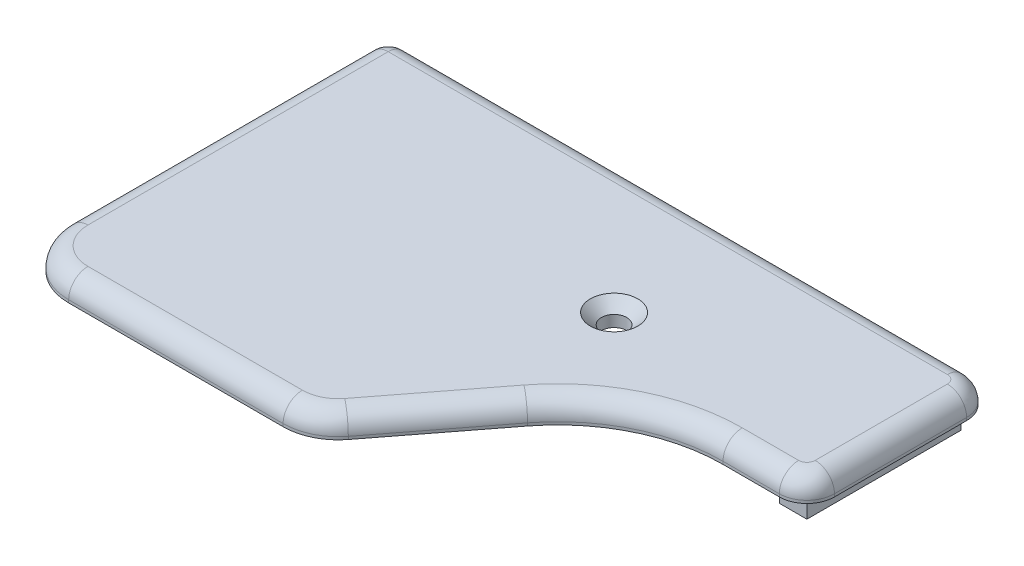
ISO-10303-21;
HEADER;
FILE_DESCRIPTION(('STEP AP214'),'2;1');
FILE_NAME('part.step','',(''),(''),'','','');
FILE_SCHEMA(('AUTOMOTIVE_DESIGN { 1 0 10303 214 1 1 1 1 }'));
ENDSEC;
DATA;
#1=APPLICATION_CONTEXT('core data for automotive mechanical design processes');
#2=APPLICATION_PROTOCOL_DEFINITION('international standard','automotive_design',2000,#1);
#3=PRODUCT_CONTEXT('',#1,'mechanical');
#4=PRODUCT('Part','Part','',(#3));
#5=PRODUCT_RELATED_PRODUCT_CATEGORY('part','',(#4));
#6=PRODUCT_DEFINITION_FORMATION('','',#4);
#7=PRODUCT_DEFINITION_CONTEXT('part definition',#1,'design');
#8=PRODUCT_DEFINITION('design','',#6,#7);
#9=PRODUCT_DEFINITION_SHAPE('','',#8);
#10=(LENGTH_UNIT() NAMED_UNIT(*) SI_UNIT(.MILLI.,.METRE.));
#11=(NAMED_UNIT(*) PLANE_ANGLE_UNIT() SI_UNIT($,.RADIAN.));
#12=(NAMED_UNIT(*) SI_UNIT($,.STERADIAN.) SOLID_ANGLE_UNIT());
#13=UNCERTAINTY_MEASURE_WITH_UNIT(LENGTH_MEASURE(1.E-05),#10,'distance_accuracy_value','');
#14=(GEOMETRIC_REPRESENTATION_CONTEXT(3) GLOBAL_UNCERTAINTY_ASSIGNED_CONTEXT((#13)) GLOBAL_UNIT_ASSIGNED_CONTEXT((#10,
#11,#12)) REPRESENTATION_CONTEXT('',''));
#15=CARTESIAN_POINT('',(0.,0.,0.));
#16=DIRECTION('',(0.,0.,1.));
#17=DIRECTION('',(1.,0.,0.));
#18=AXIS2_PLACEMENT_3D('',#15,#16,#17);
#19=CARTESIAN_POINT('',(0.,0.,0.));
#20=DIRECTION('',(0.,-1.,0.));
#21=DIRECTION('',(0.,0.,-1.));
#22=AXIS2_PLACEMENT_3D('',#19,#20,#21);
#23=PLANE('',#22);
#24=DIRECTION('',(0.,0.,1.));
#25=VECTOR('',#24,1.);
#26=CARTESIAN_POINT('',(0.,0.,38.1));
#27=LINE('',#26,#25);
#28=CARTESIAN_POINT('',(0.,0.,2.2225));
#29=VERTEX_POINT('',#28);
#30=CARTESIAN_POINT('',(0.,0.,36.83));
#31=VERTEX_POINT('',#30);
#32=EDGE_CURVE('E213',#29,#31,#27,.T.);
#33=ORIENTED_EDGE('',*,*,#32,.F.);
#34=CARTESIAN_POINT('',(2.2225,0.,2.2225));
#35=DIRECTION('',(0.,-1.,0.));
#36=DIRECTION('',(0.,0.,-1.));
#37=AXIS2_PLACEMENT_3D('',#34,#35,#36);
#38=CIRCLE('',#37,2.2225);
#39=CARTESIAN_POINT('',(2.2225,0.,0.));
#40=VERTEX_POINT('',#39);
#41=EDGE_CURVE('E271',#29,#40,#38,.T.);
#42=ORIENTED_EDGE('',*,*,#41,.T.);
#43=DIRECTION('',(-1.,0.,0.));
#44=VECTOR('',#43,1.);
#45=CARTESIAN_POINT('',(0.,0.,0.));
#46=LINE('',#45,#44);
#47=CARTESIAN_POINT('',(66.675,0.,0.));
#48=VERTEX_POINT('',#47);
#49=EDGE_CURVE('E231',#48,#40,#46,.T.);
#50=ORIENTED_EDGE('',*,*,#49,.F.);
#51=CARTESIAN_POINT('',(66.675,0.,3.175));
#52=DIRECTION('',(0.,-1.,0.));
#53=DIRECTION('',(0.,0.,-1.));
#54=AXIS2_PLACEMENT_3D('',#51,#52,#53);
#55=CIRCLE('',#54,3.175);
#56=CARTESIAN_POINT('',(69.85,0.,3.175));
#57=VERTEX_POINT('',#56);
#58=EDGE_CURVE('E259',#48,#57,#55,.T.);
#59=ORIENTED_EDGE('',*,*,#58,.T.);
#60=DIRECTION('',(0.,0.,-1.));
#61=VECTOR('',#60,1.);
#62=CARTESIAN_POINT('',(69.85,0.,0.));
#63=LINE('',#62,#61);
#64=CARTESIAN_POINT('',(69.85,0.,18.415));
#65=VERTEX_POINT('',#64);
#66=EDGE_CURVE('E228',#65,#57,#63,.T.);
#67=ORIENTED_EDGE('',*,*,#66,.F.);
#68=CARTESIAN_POINT('',(66.675,0.,18.415));
#69=DIRECTION('',(0.,-1.,0.));
#70=DIRECTION('',(0.,0.,-1.));
#71=AXIS2_PLACEMENT_3D('',#68,#69,#70);
#72=CIRCLE('',#71,3.175);
#73=CARTESIAN_POINT('',(66.675,0.,21.59));
#74=VERTEX_POINT('',#73);
#75=EDGE_CURVE('E257',#65,#74,#72,.T.);
#76=ORIENTED_EDGE('',*,*,#75,.T.);
#77=DIRECTION('',(1.,0.,0.));
#78=VECTOR('',#77,1.);
#79=CARTESIAN_POINT('',(69.85,0.,21.59));
#80=LINE('',#79,#78);
#81=CARTESIAN_POINT('',(60.1802485264324,0.,21.59));
#82=VERTEX_POINT('',#81);
#83=EDGE_CURVE('E225',#82,#74,#80,.T.);
#84=ORIENTED_EDGE('',*,*,#83,.F.);
#85=CARTESIAN_POINT('',(60.1802485264324,0.,40.64));
#86=DIRECTION('',(0.,-1.,0.));
#87=DIRECTION('',(0.,0.,-1.));
#88=AXIS2_PLACEMENT_3D('',#85,#86,#87);
#89=CIRCLE('',#88,19.05);
#90=CARTESIAN_POINT('',(45.0807615339897,0.,29.0250100058134));
#91=VERTEX_POINT('',#90);
#92=EDGE_CURVE('E239',#82,#91,#89,.F.);
#93=ORIENTED_EDGE('',*,*,#92,.T.);
#94=DIRECTION('',(0.609710760849692,0.,-0.7926239891046));
#95=VECTOR('',#94,1.);
#96=CARTESIAN_POINT('',(50.8,0.,21.59));
#97=LINE('',#96,#95);
#98=CARTESIAN_POINT('',(36.0987205143111,0.,40.7016633313956));
#99=VERTEX_POINT('',#98);
#100=EDGE_CURVE('E223',#99,#91,#97,.T.);
#101=ORIENTED_EDGE('',*,*,#100,.F.);
#102=CARTESIAN_POINT('',(31.0655581834969,0.,36.83));
#103=DIRECTION('',(0.,-1.,0.));
#104=DIRECTION('',(0.,0.,-1.));
#105=AXIS2_PLACEMENT_3D('',#102,#103,#104);
#106=CIRCLE('',#105,6.35);
#107=CARTESIAN_POINT('',(31.0655581834969,0.,43.18));
#108=VERTEX_POINT('',#107);
#109=EDGE_CURVE('E246',#99,#108,#106,.T.);
#110=ORIENTED_EDGE('',*,*,#109,.T.);
#111=DIRECTION('',(1.,0.,0.));
#112=VECTOR('',#111,1.);
#113=CARTESIAN_POINT('',(0.,0.,43.18));
#114=LINE('',#113,#112);
#115=CARTESIAN_POINT('',(6.35,0.,43.18));
#116=VERTEX_POINT('',#115);
#117=EDGE_CURVE('E220',#116,#108,#114,.T.);
#118=ORIENTED_EDGE('',*,*,#117,.F.);
#119=CARTESIAN_POINT('',(6.35,0.,36.83));
#120=DIRECTION('',(0.,-1.,0.));
#121=DIRECTION('',(0.,0.,-1.));
#122=AXIS2_PLACEMENT_3D('',#119,#120,#121);
#123=CIRCLE('',#122,6.35);
#124=EDGE_CURVE('E248',#116,#31,#123,.T.);
#125=ORIENTED_EDGE('',*,*,#124,.T.);
#126=EDGE_LOOP('',(#33,#42,#50,#59,#67,#76,#84,#93,#101,#110,#118,#125));
#127=FACE_BOUND('',#126,.T.);
#128=CARTESIAN_POINT('',(41.275,0.,15.24));
#129=DIRECTION('',(0.,1.,0.));
#130=DIRECTION('',(0.,0.,1.));
#131=AXIS2_PLACEMENT_3D('',#128,#129,#130);
#132=CIRCLE('',#131,1.46050000000001);
#133=CARTESIAN_POINT('',(41.275,0.,16.7005));
#134=VERTEX_POINT('',#133);
#135=EDGE_CURVE('E210',#134,#134,#132,.T.);
#136=ORIENTED_EDGE('',*,*,#135,.T.);
#137=EDGE_LOOP('',(#136));
#138=FACE_BOUND('',#137,.T.);
#139=DIRECTION('',(1.,0.,0.));
#140=VECTOR('',#139,1.);
#141=CARTESIAN_POINT('',(64.77,0.,1.905));
#142=LINE('',#141,#140);
#143=CARTESIAN_POINT('',(64.77,0.,1.905));
#144=VERTEX_POINT('',#143);
#145=CARTESIAN_POINT('',(67.945,0.,1.905));
#146=VERTEX_POINT('',#145);
#147=EDGE_CURVE('E364',#144,#146,#142,.T.);
#148=ORIENTED_EDGE('',*,*,#147,.F.);
#149=DIRECTION('',(0.,0.,-1.));
#150=VECTOR('',#149,1.);
#151=CARTESIAN_POINT('',(64.77,0.,19.685));
#152=LINE('',#151,#150);
#153=CARTESIAN_POINT('',(64.77,0.,19.685));
#154=VERTEX_POINT('',#153);
#155=EDGE_CURVE('E208',#154,#144,#152,.T.);
#156=ORIENTED_EDGE('',*,*,#155,.F.);
#157=DIRECTION('',(-1.,0.,0.));
#158=VECTOR('',#157,1.);
#159=CARTESIAN_POINT('',(64.77,0.,19.685));
#160=LINE('',#159,#158);
#161=CARTESIAN_POINT('',(67.945,0.,19.685));
#162=VERTEX_POINT('',#161);
#163=EDGE_CURVE('E204',#162,#154,#160,.T.);
#164=ORIENTED_EDGE('',*,*,#163,.F.);
#165=DIRECTION('',(0.,0.,1.));
#166=VECTOR('',#165,1.);
#167=CARTESIAN_POINT('',(67.945,0.,19.685));
#168=LINE('',#167,#166);
#169=EDGE_CURVE('E366',#146,#162,#168,.T.);
#170=ORIENTED_EDGE('',*,*,#169,.F.);
#171=EDGE_LOOP('',(#148,#156,#164,#170));
#172=FACE_BOUND('',#171,.T.);
#173=ADVANCED_FACE('F37',(#127,#138,#172),#23,.T.);
#174=CARTESIAN_POINT('',(0.,2.54,0.));
#175=DIRECTION('',(0.,-1.,0.));
#176=DIRECTION('',(0.,0.,-1.));
#177=AXIS2_PLACEMENT_3D('',#174,#175,#176);
#178=PLANE('',#177);
#179=CARTESIAN_POINT('',(66.675,2.54,3.175));
#180=DIRECTION('',(0.,-1.,0.));
#181=DIRECTION('',(0.,0.,-1.));
#182=AXIS2_PLACEMENT_3D('',#179,#180,#181);
#183=CIRCLE('',#182,0.9525);
#184=CARTESIAN_POINT('',(67.6275,2.54,3.175));
#185=VERTEX_POINT('',#184);
#186=CARTESIAN_POINT('',(66.675,2.54,2.2225));
#187=VERTEX_POINT('',#186);
#188=EDGE_CURVE('E303',#185,#187,#183,.F.);
#189=ORIENTED_EDGE('',*,*,#188,.T.);
#190=DIRECTION('',(-1.,0.,0.));
#191=VECTOR('',#190,1.);
#192=CARTESIAN_POINT('',(0.,2.54,2.2225));
#193=LINE('',#192,#191);
#194=CARTESIAN_POINT('',(2.22249999999999,2.54,2.2225));
#195=VERTEX_POINT('',#194);
#196=EDGE_CURVE('E305',#187,#195,#193,.T.);
#197=ORIENTED_EDGE('',*,*,#196,.T.);
#198=DIRECTION('',(0.,0.,1.));
#199=VECTOR('',#198,1.);
#200=CARTESIAN_POINT('',(2.22249999999999,2.54,0.));
#201=LINE('',#200,#199);
#202=CARTESIAN_POINT('',(2.2225,2.54,36.83));
#203=VERTEX_POINT('',#202);
#204=EDGE_CURVE('E285',#195,#203,#201,.T.);
#205=ORIENTED_EDGE('',*,*,#204,.T.);
#206=CARTESIAN_POINT('',(6.35,2.54,36.83));
#207=DIRECTION('',(0.,-1.,0.));
#208=DIRECTION('',(0.,0.,-1.));
#209=AXIS2_PLACEMENT_3D('',#206,#207,#208);
#210=CIRCLE('',#209,4.1275);
#211=CARTESIAN_POINT('',(6.35,2.54,40.9575));
#212=VERTEX_POINT('',#211);
#213=EDGE_CURVE('E287',#203,#212,#210,.F.);
#214=ORIENTED_EDGE('',*,*,#213,.T.);
#215=DIRECTION('',(1.,0.,0.));
#216=VECTOR('',#215,1.);
#217=CARTESIAN_POINT('',(0.,2.54,40.9575));
#218=LINE('',#217,#216);
#219=CARTESIAN_POINT('',(31.0655581834969,2.54,40.9575));
#220=VERTEX_POINT('',#219);
#221=EDGE_CURVE('E289',#212,#220,#218,.T.);
#222=ORIENTED_EDGE('',*,*,#221,.T.);
#223=CARTESIAN_POINT('',(31.0655581834969,2.54,36.83));
#224=DIRECTION('',(0.,-1.,0.));
#225=DIRECTION('',(0.,0.,-1.));
#226=AXIS2_PLACEMENT_3D('',#223,#224,#225);
#227=CIRCLE('',#226,4.1275);
#228=CARTESIAN_POINT('',(34.3371136985261,2.54,39.3465811654071));
#229=VERTEX_POINT('',#228);
#230=EDGE_CURVE('E291',#220,#229,#227,.F.);
#231=ORIENTED_EDGE('',*,*,#230,.T.);
#232=DIRECTION('',(0.609710760849692,0.,-0.7926239891046));
#233=VECTOR('',#232,1.);
#234=CARTESIAN_POINT('',(40.5874638161853,2.54,31.2211260124502));
#235=LINE('',#234,#233);
#236=CARTESIAN_POINT('',(43.3191547182048,2.54,27.6699278398249));
#237=VERTEX_POINT('',#236);
#238=EDGE_CURVE('E293',#229,#237,#235,.T.);
#239=ORIENTED_EDGE('',*,*,#238,.T.);
#240=CARTESIAN_POINT('',(60.1802485264324,2.54,40.64));
#241=DIRECTION('',(0.,-1.,0.));
#242=DIRECTION('',(0.,0.,-1.));
#243=AXIS2_PLACEMENT_3D('',#240,#241,#242);
#244=CIRCLE('',#243,21.2725);
#245=CARTESIAN_POINT('',(60.1802485264324,2.54,19.3675));
#246=VERTEX_POINT('',#245);
#247=EDGE_CURVE('E295',#237,#246,#244,.T.);
#248=ORIENTED_EDGE('',*,*,#247,.T.);
#249=DIRECTION('',(1.,0.,0.));
#250=VECTOR('',#249,1.);
#251=CARTESIAN_POINT('',(0.,2.54,19.3675));
#252=LINE('',#251,#250);
#253=CARTESIAN_POINT('',(66.675,2.54,19.3675));
#254=VERTEX_POINT('',#253);
#255=EDGE_CURVE('E297',#246,#254,#252,.T.);
#256=ORIENTED_EDGE('',*,*,#255,.T.);
#257=CARTESIAN_POINT('',(66.675,2.54,18.415));
#258=DIRECTION('',(0.,-1.,0.));
#259=DIRECTION('',(0.,0.,-1.));
#260=AXIS2_PLACEMENT_3D('',#257,#258,#259);
#261=CIRCLE('',#260,0.9525);
#262=CARTESIAN_POINT('',(67.6275,2.54,18.415));
#263=VERTEX_POINT('',#262);
#264=EDGE_CURVE('E299',#254,#263,#261,.F.);
#265=ORIENTED_EDGE('',*,*,#264,.T.);
#266=DIRECTION('',(0.,0.,-1.));
#267=VECTOR('',#266,1.);
#268=CARTESIAN_POINT('',(67.6275,2.54,0.));
#269=LINE('',#268,#267);
#270=EDGE_CURVE('E301',#263,#185,#269,.T.);
#271=ORIENTED_EDGE('',*,*,#270,.T.);
#272=EDGE_LOOP('',(#189,#197,#205,#214,#222,#231,#239,#248,#256,#265,#271));
#273=FACE_BOUND('',#272,.T.);
#274=CARTESIAN_POINT('',(41.275,2.54,15.24));
#275=DIRECTION('',(0.,-1.,0.));
#276=DIRECTION('',(0.,0.,-1.));
#277=AXIS2_PLACEMENT_3D('',#274,#275,#276);
#278=CIRCLE('',#277,2.73050000000003);
#279=CARTESIAN_POINT('',(41.275,2.54,17.9705));
#280=VERTEX_POINT('',#279);
#281=EDGE_CURVE('E279',#280,#280,#278,.T.);
#282=ORIENTED_EDGE('',*,*,#281,.T.);
#283=EDGE_LOOP('',(#282));
#284=FACE_BOUND('',#283,.T.);
#285=ADVANCED_FACE('F384',(#273,#284),#178,.F.);
#286=CARTESIAN_POINT('',(0.,2.54,38.1));
#287=DIRECTION('',(1.,0.,0.));
#288=DIRECTION('',(0.,0.,-1.));
#289=AXIS2_PLACEMENT_3D('',#286,#287,#288);
#290=PLANE('',#289);
#291=DIRECTION('',(0.,-1.,0.));
#292=VECTOR('',#291,1.);
#293=CARTESIAN_POINT('',(0.,2.54,36.83));
#294=LINE('',#293,#292);
#295=CARTESIAN_POINT('',(0.,0.317500000000001,36.83));
#296=VERTEX_POINT('',#295);
#297=EDGE_CURVE('E251',#31,#296,#294,.F.);
#298=ORIENTED_EDGE('',*,*,#297,.T.);
#299=DIRECTION('',(0.,0.,1.));
#300=VECTOR('',#299,1.);
#301=CARTESIAN_POINT('',(0.,0.317500000000001,38.1));
#302=LINE('',#301,#300);
#303=CARTESIAN_POINT('',(0.,0.317500000000001,2.2225));
#304=VERTEX_POINT('',#303);
#305=EDGE_CURVE('E11',#296,#304,#302,.F.);
#306=ORIENTED_EDGE('',*,*,#305,.T.);
#307=DIRECTION('',(0.,-1.,0.));
#308=VECTOR('',#307,1.);
#309=CARTESIAN_POINT('',(0.,2.54,2.2225));
#310=LINE('',#309,#308);
#311=EDGE_CURVE('E269',#304,#29,#310,.T.);
#312=ORIENTED_EDGE('',*,*,#311,.T.);
#313=ORIENTED_EDGE('',*,*,#32,.T.);
#314=EDGE_LOOP('',(#298,#306,#312,#313));
#315=FACE_BOUND('',#314,.T.);
#316=ADVANCED_FACE('F392',(#315),#290,.F.);
#317=CARTESIAN_POINT('',(0.,2.54,43.18));
#318=DIRECTION('',(0.,0.,-1.));
#319=DIRECTION('',(-1.,0.,0.));
#320=AXIS2_PLACEMENT_3D('',#317,#318,#319);
#321=PLANE('',#320);
#322=DIRECTION('',(0.,-1.,0.));
#323=VECTOR('',#322,1.);
#324=CARTESIAN_POINT('',(31.0655581834969,2.54,43.18));
#325=LINE('',#324,#323);
#326=CARTESIAN_POINT('',(31.0655581834969,0.317500000000001,43.18));
#327=VERTEX_POINT('',#326);
#328=EDGE_CURVE('E242',#108,#327,#325,.F.);
#329=ORIENTED_EDGE('',*,*,#328,.T.);
#330=DIRECTION('',(1.,0.,0.));
#331=VECTOR('',#330,1.);
#332=CARTESIAN_POINT('',(0.,0.317500000000001,43.18));
#333=LINE('',#332,#331);
#334=CARTESIAN_POINT('',(6.35,0.317500000000001,43.18));
#335=VERTEX_POINT('',#334);
#336=EDGE_CURVE('E61',#327,#335,#333,.F.);
#337=ORIENTED_EDGE('',*,*,#336,.T.);
#338=DIRECTION('',(0.,-1.,0.));
#339=VECTOR('',#338,1.);
#340=CARTESIAN_POINT('',(6.35,2.54,43.18));
#341=LINE('',#340,#339);
#342=EDGE_CURVE('E244',#335,#116,#341,.T.);
#343=ORIENTED_EDGE('',*,*,#342,.T.);
#344=ORIENTED_EDGE('',*,*,#117,.T.);
#345=EDGE_LOOP('',(#329,#337,#343,#344));
#346=FACE_BOUND('',#345,.T.);
#347=ADVANCED_FACE('F415',(#346),#321,.F.);
#348=CARTESIAN_POINT('',(50.8,2.54,21.59));
#349=DIRECTION('',(-0.7926239891046,0.,-0.609710760849692));
#350=DIRECTION('',(-0.609710760849692,0.,0.7926239891046));
#351=AXIS2_PLACEMENT_3D('',#348,#349,#350);
#352=PLANE('',#351);
#353=DIRECTION('',(0.,-1.,0.));
#354=VECTOR('',#353,1.);
#355=CARTESIAN_POINT('',(45.0807615339897,2.54,29.0250100058134));
#356=LINE('',#355,#354);
#357=CARTESIAN_POINT('',(45.0807615339897,0.317500000000001,29.0250100058134));
#358=VERTEX_POINT('',#357);
#359=EDGE_CURVE('E236',#91,#358,#356,.F.);
#360=ORIENTED_EDGE('',*,*,#359,.T.);
#361=DIRECTION('',(0.609710760849692,0.,-0.7926239891046));
#362=VECTOR('',#361,1.);
#363=CARTESIAN_POINT('',(50.8,0.317500000000001,21.59));
#364=LINE('',#363,#362);
#365=CARTESIAN_POINT('',(36.0987205143111,0.3175,40.7016633313956));
#366=VERTEX_POINT('',#365);
#367=EDGE_CURVE('E320',#358,#366,#364,.F.);
#368=ORIENTED_EDGE('',*,*,#367,.T.);
#369=DIRECTION('',(0.,-1.,0.));
#370=VECTOR('',#369,1.);
#371=CARTESIAN_POINT('',(36.0987205143111,2.54,40.7016633313956));
#372=LINE('',#371,#370);
#373=EDGE_CURVE('E253',#366,#99,#372,.T.);
#374=ORIENTED_EDGE('',*,*,#373,.T.);
#375=ORIENTED_EDGE('',*,*,#100,.T.);
#376=EDGE_LOOP('',(#360,#368,#374,#375));
#377=FACE_BOUND('',#376,.T.);
#378=ADVANCED_FACE('F411',(#377),#352,.F.);
#379=CARTESIAN_POINT('',(69.85,2.54,21.59));
#380=DIRECTION('',(0.,0.,-1.));
#381=DIRECTION('',(-1.,0.,0.));
#382=AXIS2_PLACEMENT_3D('',#379,#380,#381);
#383=PLANE('',#382);
#384=DIRECTION('',(0.,-1.,0.));
#385=VECTOR('',#384,1.);
#386=CARTESIAN_POINT('',(66.675,2.54,21.59));
#387=LINE('',#386,#385);
#388=CARTESIAN_POINT('',(66.675,0.317500000000001,21.59));
#389=VERTEX_POINT('',#388);
#390=EDGE_CURVE('E266',#74,#389,#387,.F.);
#391=ORIENTED_EDGE('',*,*,#390,.T.);
#392=DIRECTION('',(1.,0.,0.));
#393=VECTOR('',#392,1.);
#394=CARTESIAN_POINT('',(69.85,0.317500000000001,21.59));
#395=LINE('',#394,#393);
#396=CARTESIAN_POINT('',(60.1802485264324,0.317500000000001,21.59));
#397=VERTEX_POINT('',#396);
#398=EDGE_CURVE('E316',#389,#397,#395,.F.);
#399=ORIENTED_EDGE('',*,*,#398,.T.);
#400=DIRECTION('',(0.,-1.,0.));
#401=VECTOR('',#400,1.);
#402=CARTESIAN_POINT('',(60.1802485264324,0.,21.59));
#403=LINE('',#402,#401);
#404=EDGE_CURVE('E234',#397,#82,#403,.T.);
#405=ORIENTED_EDGE('',*,*,#404,.T.);
#406=ORIENTED_EDGE('',*,*,#83,.T.);
#407=EDGE_LOOP('',(#391,#399,#405,#406));
#408=FACE_BOUND('',#407,.T.);
#409=ADVANCED_FACE('F407',(#408),#383,.F.);
#410=CARTESIAN_POINT('',(69.85,2.54,0.));
#411=DIRECTION('',(-1.,0.,0.));
#412=DIRECTION('',(0.,0.,1.));
#413=AXIS2_PLACEMENT_3D('',#410,#411,#412);
#414=PLANE('',#413);
#415=DIRECTION('',(0.,-1.,0.));
#416=VECTOR('',#415,1.);
#417=CARTESIAN_POINT('',(69.85,2.54,3.175));
#418=LINE('',#417,#416);
#419=CARTESIAN_POINT('',(69.85,0.317500000000001,3.175));
#420=VERTEX_POINT('',#419);
#421=EDGE_CURVE('E263',#57,#420,#418,.F.);
#422=ORIENTED_EDGE('',*,*,#421,.T.);
#423=DIRECTION('',(0.,0.,-1.));
#424=VECTOR('',#423,1.);
#425=CARTESIAN_POINT('',(69.85,0.317500000000001,0.));
#426=LINE('',#425,#424);
#427=CARTESIAN_POINT('',(69.85,0.317500000000001,18.415));
#428=VERTEX_POINT('',#427);
#429=EDGE_CURVE('E312',#420,#428,#426,.F.);
#430=ORIENTED_EDGE('',*,*,#429,.T.);
#431=DIRECTION('',(0.,-1.,0.));
#432=VECTOR('',#431,1.);
#433=CARTESIAN_POINT('',(69.85,2.54,18.415));
#434=LINE('',#433,#432);
#435=EDGE_CURVE('E261',#428,#65,#434,.T.);
#436=ORIENTED_EDGE('',*,*,#435,.T.);
#437=ORIENTED_EDGE('',*,*,#66,.T.);
#438=EDGE_LOOP('',(#422,#430,#436,#437));
#439=FACE_BOUND('',#438,.T.);
#440=ADVANCED_FACE('F403',(#439),#414,.F.);
#441=CARTESIAN_POINT('',(0.,2.54,0.));
#442=DIRECTION('',(0.,0.,1.));
#443=DIRECTION('',(1.,0.,0.));
#444=AXIS2_PLACEMENT_3D('',#441,#442,#443);
#445=PLANE('',#444);
#446=DIRECTION('',(0.,-1.,0.));
#447=VECTOR('',#446,1.);
#448=CARTESIAN_POINT('',(2.2225,2.54,0.));
#449=LINE('',#448,#447);
#450=CARTESIAN_POINT('',(2.2225,0.317500000000001,0.));
#451=VERTEX_POINT('',#450);
#452=EDGE_CURVE('E273',#40,#451,#449,.F.);
#453=ORIENTED_EDGE('',*,*,#452,.T.);
#454=DIRECTION('',(-1.,0.,0.));
#455=VECTOR('',#454,1.);
#456=CARTESIAN_POINT('',(0.,0.317500000000001,0.));
#457=LINE('',#456,#455);
#458=CARTESIAN_POINT('',(66.675,0.317500000000001,0.));
#459=VERTEX_POINT('',#458);
#460=EDGE_CURVE('E308',#451,#459,#457,.F.);
#461=ORIENTED_EDGE('',*,*,#460,.T.);
#462=DIRECTION('',(0.,-1.,0.));
#463=VECTOR('',#462,1.);
#464=CARTESIAN_POINT('',(66.675,2.54,0.));
#465=LINE('',#464,#463);
#466=EDGE_CURVE('E255',#459,#48,#465,.T.);
#467=ORIENTED_EDGE('',*,*,#466,.T.);
#468=ORIENTED_EDGE('',*,*,#49,.T.);
#469=EDGE_LOOP('',(#453,#461,#467,#468));
#470=FACE_BOUND('',#469,.T.);
#471=ADVANCED_FACE('F399',(#470),#445,.F.);
#472=CARTESIAN_POINT('',(41.275,2.54,15.24));
#473=DIRECTION('',(0.,-1.,0.));
#474=DIRECTION('',(0.,0.,-1.));
#475=AXIS2_PLACEMENT_3D('',#472,#473,#474);
#476=CYLINDRICAL_SURFACE('',#475,1.46050000000001);
#477=CARTESIAN_POINT('',(41.275,1.313575255995,15.24));
#478=DIRECTION('',(0.,-1.,0.));
#479=DIRECTION('',(0.,0.,-1.));
#480=AXIS2_PLACEMENT_3D('',#477,#478,#479);
#481=CIRCLE('',#480,1.46050000000001);
#482=CARTESIAN_POINT('',(41.275,1.313575255995,16.7005));
#483=VERTEX_POINT('',#482);
#484=EDGE_CURVE('E276',#483,#483,#481,.F.);
#485=ORIENTED_EDGE('',*,*,#484,.T.);
#486=EDGE_LOOP('',(#485));
#487=FACE_BOUND('',#486,.T.);
#488=ORIENTED_EDGE('',*,*,#135,.F.);
#489=EDGE_LOOP('',(#488));
#490=FACE_BOUND('',#489,.T.);
#491=ADVANCED_FACE('F402',(#487,#490),#476,.F.);
#492=CARTESIAN_POINT('',(64.77,-2.54,19.685));
#493=DIRECTION('',(1.,0.,0.));
#494=DIRECTION('',(0.,0.,-1.));
#495=AXIS2_PLACEMENT_3D('',#492,#493,#494);
#496=PLANE('',#495);
#497=ORIENTED_EDGE('',*,*,#155,.T.);
#498=DIRECTION('',(0.,1.,0.));
#499=VECTOR('',#498,1.);
#500=CARTESIAN_POINT('',(64.77,-2.54,1.905));
#501=LINE('',#500,#499);
#502=CARTESIAN_POINT('',(64.77,-2.54,1.905));
#503=VERTEX_POINT('',#502);
#504=EDGE_CURVE('E188',#503,#144,#501,.T.);
#505=ORIENTED_EDGE('',*,*,#504,.F.);
#506=DIRECTION('',(0.,0.,-1.));
#507=VECTOR('',#506,1.);
#508=CARTESIAN_POINT('',(64.77,-2.54,19.685));
#509=LINE('',#508,#507);
#510=CARTESIAN_POINT('',(64.77,-2.54,19.685));
#511=VERTEX_POINT('',#510);
#512=EDGE_CURVE('E195',#511,#503,#509,.T.);
#513=ORIENTED_EDGE('',*,*,#512,.F.);
#514=DIRECTION('',(0.,1.,0.));
#515=VECTOR('',#514,1.);
#516=CARTESIAN_POINT('',(64.77,-2.54,19.685));
#517=LINE('',#516,#515);
#518=EDGE_CURVE('E374',#511,#154,#517,.T.);
#519=ORIENTED_EDGE('',*,*,#518,.T.);
#520=EDGE_LOOP('',(#497,#505,#513,#519));
#521=FACE_BOUND('',#520,.T.);
#522=ADVANCED_FACE('F206',(#521),#496,.F.);
#523=CARTESIAN_POINT('',(64.77,-2.54,1.905));
#524=DIRECTION('',(0.,0.,1.));
#525=DIRECTION('',(1.,0.,0.));
#526=AXIS2_PLACEMENT_3D('',#523,#524,#525);
#527=PLANE('',#526);
#528=ORIENTED_EDGE('',*,*,#147,.T.);
#529=DIRECTION('',(0.,1.,0.));
#530=VECTOR('',#529,1.);
#531=CARTESIAN_POINT('',(67.945,-2.54,1.905));
#532=LINE('',#531,#530);
#533=CARTESIAN_POINT('',(67.945,-2.54,1.905));
#534=VERTEX_POINT('',#533);
#535=EDGE_CURVE('E191',#534,#146,#532,.T.);
#536=ORIENTED_EDGE('',*,*,#535,.F.);
#537=DIRECTION('',(1.,0.,0.));
#538=VECTOR('',#537,1.);
#539=CARTESIAN_POINT('',(64.77,-2.54,1.905));
#540=LINE('',#539,#538);
#541=EDGE_CURVE('E184',#503,#534,#540,.T.);
#542=ORIENTED_EDGE('',*,*,#541,.F.);
#543=ORIENTED_EDGE('',*,*,#504,.T.);
#544=EDGE_LOOP('',(#528,#536,#542,#543));
#545=FACE_BOUND('',#544,.T.);
#546=ADVANCED_FACE('F186',(#545),#527,.F.);
#547=CARTESIAN_POINT('',(67.945,-2.54,19.685));
#548=DIRECTION('',(-1.,0.,0.));
#549=DIRECTION('',(0.,0.,1.));
#550=AXIS2_PLACEMENT_3D('',#547,#548,#549);
#551=PLANE('',#550);
#552=ORIENTED_EDGE('',*,*,#169,.T.);
#553=DIRECTION('',(0.,1.,0.));
#554=VECTOR('',#553,1.);
#555=CARTESIAN_POINT('',(67.945,-2.54,19.685));
#556=LINE('',#555,#554);
#557=CARTESIAN_POINT('',(67.945,-2.54,19.685));
#558=VERTEX_POINT('',#557);
#559=EDGE_CURVE('E215',#558,#162,#556,.T.);
#560=ORIENTED_EDGE('',*,*,#559,.F.);
#561=DIRECTION('',(0.,0.,1.));
#562=VECTOR('',#561,1.);
#563=CARTESIAN_POINT('',(67.945,-2.54,19.685));
#564=LINE('',#563,#562);
#565=EDGE_CURVE('E194',#534,#558,#564,.T.);
#566=ORIENTED_EDGE('',*,*,#565,.F.);
#567=ORIENTED_EDGE('',*,*,#535,.T.);
#568=EDGE_LOOP('',(#552,#560,#566,#567));
#569=FACE_BOUND('',#568,.T.);
#570=ADVANCED_FACE('F381',(#569),#551,.F.);
#571=CARTESIAN_POINT('',(64.77,-2.54,19.685));
#572=DIRECTION('',(0.,0.,-1.));
#573=DIRECTION('',(-1.,0.,0.));
#574=AXIS2_PLACEMENT_3D('',#571,#572,#573);
#575=PLANE('',#574);
#576=ORIENTED_EDGE('',*,*,#163,.T.);
#577=ORIENTED_EDGE('',*,*,#518,.F.);
#578=DIRECTION('',(-1.,0.,0.));
#579=VECTOR('',#578,1.);
#580=CARTESIAN_POINT('',(64.77,-2.54,19.685));
#581=LINE('',#580,#579);
#582=EDGE_CURVE('E200',#558,#511,#581,.T.);
#583=ORIENTED_EDGE('',*,*,#582,.F.);
#584=ORIENTED_EDGE('',*,*,#559,.T.);
#585=EDGE_LOOP('',(#576,#577,#583,#584));
#586=FACE_BOUND('',#585,.T.);
#587=ADVANCED_FACE('F377',(#586),#575,.F.);
#588=CARTESIAN_POINT('',(0.,-2.54,0.));
#589=DIRECTION('',(0.,-1.,0.));
#590=DIRECTION('',(0.,0.,-1.));
#591=AXIS2_PLACEMENT_3D('',#588,#589,#590);
#592=PLANE('',#591);
#593=ORIENTED_EDGE('',*,*,#512,.T.);
#594=ORIENTED_EDGE('',*,*,#541,.T.);
#595=ORIENTED_EDGE('',*,*,#565,.T.);
#596=ORIENTED_EDGE('',*,*,#582,.T.);
#597=EDGE_LOOP('',(#593,#594,#595,#596));
#598=FACE_BOUND('',#597,.T.);
#599=ADVANCED_FACE('F198',(#598),#592,.T.);
#600=CARTESIAN_POINT('',(60.1802485264324,2.54,40.64));
#601=DIRECTION('',(0.,1.,0.));
#602=DIRECTION('',(0.,0.,1.));
#603=AXIS2_PLACEMENT_3D('',#600,#601,#602);
#604=CYLINDRICAL_SURFACE('',#603,19.05);
#605=ORIENTED_EDGE('',*,*,#404,.F.);
#606=CARTESIAN_POINT('',(60.1802485264324,0.317500000000001,40.64));
#607=DIRECTION('',(0.,-1.,0.));
#608=DIRECTION('',(0.,0.,-1.));
#609=AXIS2_PLACEMENT_3D('',#606,#607,#608);
#610=CIRCLE('',#609,19.05);
#611=EDGE_CURVE('E318',#397,#358,#610,.F.);
#612=ORIENTED_EDGE('',*,*,#611,.T.);
#613=ORIENTED_EDGE('',*,*,#359,.F.);
#614=ORIENTED_EDGE('',*,*,#92,.F.);
#615=EDGE_LOOP('',(#605,#612,#613,#614));
#616=FACE_BOUND('',#615,.T.);
#617=ADVANCED_FACE('F422',(#616),#604,.F.);
#618=CARTESIAN_POINT('',(6.35,2.54,36.83));
#619=DIRECTION('',(0.,-1.,0.));
#620=DIRECTION('',(0.,0.,-1.));
#621=AXIS2_PLACEMENT_3D('',#618,#619,#620);
#622=CYLINDRICAL_SURFACE('',#621,6.35);
#623=ORIENTED_EDGE('',*,*,#342,.F.);
#624=CARTESIAN_POINT('',(6.35,0.317500000000001,36.83));
#625=DIRECTION('',(0.,-1.,0.));
#626=DIRECTION('',(0.,0.,-1.));
#627=AXIS2_PLACEMENT_3D('',#624,#625,#626);
#628=CIRCLE('',#627,6.35);
#629=EDGE_CURVE('E46',#335,#296,#628,.T.);
#630=ORIENTED_EDGE('',*,*,#629,.T.);
#631=ORIENTED_EDGE('',*,*,#297,.F.);
#632=ORIENTED_EDGE('',*,*,#124,.F.);
#633=EDGE_LOOP('',(#623,#630,#631,#632));
#634=FACE_BOUND('',#633,.T.);
#635=ADVANCED_FACE('F425',(#634),#622,.T.);
#636=CARTESIAN_POINT('',(31.0655581834969,2.54,36.83));
#637=DIRECTION('',(0.,-1.,0.));
#638=DIRECTION('',(0.,0.,-1.));
#639=AXIS2_PLACEMENT_3D('',#636,#637,#638);
#640=CYLINDRICAL_SURFACE('',#639,6.35);
#641=ORIENTED_EDGE('',*,*,#373,.F.);
#642=CARTESIAN_POINT('',(31.0655581834969,0.3175,36.83));
#643=DIRECTION('',(0.,-1.,0.));
#644=DIRECTION('',(0.,0.,-1.));
#645=AXIS2_PLACEMENT_3D('',#642,#643,#644);
#646=CIRCLE('',#645,6.35);
#647=EDGE_CURVE('E322',#366,#327,#646,.T.);
#648=ORIENTED_EDGE('',*,*,#647,.T.);
#649=ORIENTED_EDGE('',*,*,#328,.F.);
#650=ORIENTED_EDGE('',*,*,#109,.F.);
#651=EDGE_LOOP('',(#641,#648,#649,#650));
#652=FACE_BOUND('',#651,.T.);
#653=ADVANCED_FACE('F429',(#652),#640,.T.);
#654=CARTESIAN_POINT('',(66.675,2.54,3.175));
#655=DIRECTION('',(0.,-1.,0.));
#656=DIRECTION('',(0.,0.,-1.));
#657=AXIS2_PLACEMENT_3D('',#654,#655,#656);
#658=CYLINDRICAL_SURFACE('',#657,3.175);
#659=ORIENTED_EDGE('',*,*,#466,.F.);
#660=CARTESIAN_POINT('',(66.675,0.317500000000001,3.175));
#661=DIRECTION('',(0.,-1.,0.));
#662=DIRECTION('',(0.,0.,-1.));
#663=AXIS2_PLACEMENT_3D('',#660,#661,#662);
#664=CIRCLE('',#663,3.175);
#665=EDGE_CURVE('E310',#459,#420,#664,.T.);
#666=ORIENTED_EDGE('',*,*,#665,.T.);
#667=ORIENTED_EDGE('',*,*,#421,.F.);
#668=ORIENTED_EDGE('',*,*,#58,.F.);
#669=EDGE_LOOP('',(#659,#666,#667,#668));
#670=FACE_BOUND('',#669,.T.);
#671=ADVANCED_FACE('F432',(#670),#658,.T.);
#672=CARTESIAN_POINT('',(66.675,2.54,18.415));
#673=DIRECTION('',(0.,-1.,0.));
#674=DIRECTION('',(0.,0.,-1.));
#675=AXIS2_PLACEMENT_3D('',#672,#673,#674);
#676=CYLINDRICAL_SURFACE('',#675,3.175);
#677=ORIENTED_EDGE('',*,*,#435,.F.);
#678=CARTESIAN_POINT('',(66.675,0.317500000000001,18.415));
#679=DIRECTION('',(0.,-1.,0.));
#680=DIRECTION('',(0.,0.,-1.));
#681=AXIS2_PLACEMENT_3D('',#678,#679,#680);
#682=CIRCLE('',#681,3.175);
#683=EDGE_CURVE('E314',#428,#389,#682,.T.);
#684=ORIENTED_EDGE('',*,*,#683,.T.);
#685=ORIENTED_EDGE('',*,*,#390,.F.);
#686=ORIENTED_EDGE('',*,*,#75,.F.);
#687=EDGE_LOOP('',(#677,#684,#685,#686));
#688=FACE_BOUND('',#687,.T.);
#689=ADVANCED_FACE('F436',(#688),#676,.T.);
#690=CARTESIAN_POINT('',(2.2225,2.54,2.2225));
#691=DIRECTION('',(0.,-1.,0.));
#692=DIRECTION('',(0.,0.,-1.));
#693=AXIS2_PLACEMENT_3D('',#690,#691,#692);
#694=CYLINDRICAL_SURFACE('',#693,2.2225);
#695=ORIENTED_EDGE('',*,*,#311,.F.);
#696=CARTESIAN_POINT('',(2.2225,0.317500000000001,2.2225));
#697=DIRECTION('',(0.,-1.,0.));
#698=DIRECTION('',(0.,0.,-1.));
#699=AXIS2_PLACEMENT_3D('',#696,#697,#698);
#700=CIRCLE('',#699,2.2225);
#701=EDGE_CURVE('E282',#304,#451,#700,.T.);
#702=ORIENTED_EDGE('',*,*,#701,.T.);
#703=ORIENTED_EDGE('',*,*,#452,.F.);
#704=ORIENTED_EDGE('',*,*,#41,.F.);
#705=EDGE_LOOP('',(#695,#702,#703,#704));
#706=FACE_BOUND('',#705,.T.);
#707=ADVANCED_FACE('F440',(#706),#694,.T.);
#708=CARTESIAN_POINT('',(41.275,1.313575255995,15.24));
#709=DIRECTION('',(0.,1.,0.));
#710=DIRECTION('',(0.,0.,1.));
#711=AXIS2_PLACEMENT_3D('',#708,#709,#710);
#712=CONICAL_SURFACE('',#711,1.46050000000001,0.802851455917395);
#713=CARTESIAN_POINT('',(41.275,2.54,17.9705));
#714=CARTESIAN_POINT('',(41.275,2.52722474224995,17.9572708333334));
#715=CARTESIAN_POINT('',(41.275,2.5144494844999,17.9440416666667));
#716=CARTESIAN_POINT('',(41.275,2.48889896899979,17.9175833333334));
#717=CARTESIAN_POINT('',(41.275,2.47612371124974,17.9043541666667));
#718=CARTESIAN_POINT('',(41.275,2.45057319574964,17.8778958333334));
#719=CARTESIAN_POINT('',(41.275,2.43779793799958,17.8646666666667));
#720=CARTESIAN_POINT('',(41.275,2.41224742249948,17.8382083333334));
#721=CARTESIAN_POINT('',(41.275,2.39947216474943,17.8249791666667));
#722=CARTESIAN_POINT('',(41.275,2.37392164924932,17.7985208333334));
#723=CARTESIAN_POINT('',(41.275,2.36114639149927,17.7852916666667));
#724=CARTESIAN_POINT('',(41.275,2.33559587599917,17.7588333333334));
#725=CARTESIAN_POINT('',(41.275,2.32282061824911,17.7456041666667));
#726=CARTESIAN_POINT('',(41.275,2.29727010274901,17.7191458333334));
#727=CARTESIAN_POINT('',(41.275,2.28449484499896,17.7059166666667));
#728=CARTESIAN_POINT('',(41.275,2.25894432949885,17.6794583333334));
#729=CARTESIAN_POINT('',(41.275,2.2461690717488,17.6662291666667));
#730=CARTESIAN_POINT('',(41.275,2.2206185562487,17.6397708333334));
#731=CARTESIAN_POINT('',(41.275,2.20784329849865,17.6265416666667));
#732=CARTESIAN_POINT('',(41.275,2.18229278299854,17.6000833333334));
#733=CARTESIAN_POINT('',(41.275,2.16951752524849,17.5868541666667));
#734=CARTESIAN_POINT('',(41.275,2.14396700974839,17.5603958333334));
#735=CARTESIAN_POINT('',(41.275,2.13119175199833,17.5471666666667));
#736=CARTESIAN_POINT('',(41.275,2.10564123649823,17.5207083333334));
#737=CARTESIAN_POINT('',(41.275,2.09286597874818,17.5074791666667));
#738=CARTESIAN_POINT('',(41.275,2.06731546324807,17.4810208333334));
#739=CARTESIAN_POINT('',(41.275,2.05454020549802,17.4677916666667));
#740=CARTESIAN_POINT('',(41.275,2.02898968999792,17.4413333333334));
#741=CARTESIAN_POINT('',(41.275,2.01621443224786,17.4281041666667));
#742=CARTESIAN_POINT('',(41.275,1.99066391674776,17.4016458333334));
#743=CARTESIAN_POINT('',(41.275,1.97788865899771,17.3884166666667));
#744=CARTESIAN_POINT('',(41.275,1.9523381434976,17.3619583333334));
#745=CARTESIAN_POINT('',(41.275,1.93956288574755,17.3487291666667));
#746=CARTESIAN_POINT('',(41.275,1.91401237024745,17.3222708333334));
#747=CARTESIAN_POINT('',(41.275,1.9012371124974,17.3090416666667));
#748=CARTESIAN_POINT('',(41.275,1.87568659699729,17.2825833333334));
#749=CARTESIAN_POINT('',(41.275,1.86291133924724,17.2693541666667));
#750=CARTESIAN_POINT('',(41.275,1.83736082374714,17.2428958333333));
#751=CARTESIAN_POINT('',(41.275,1.82458556599708,17.2296666666667));
#752=CARTESIAN_POINT('',(41.275,1.79903505049698,17.2032083333334));
#753=CARTESIAN_POINT('',(41.275,1.78625979274693,17.1899791666667));
#754=CARTESIAN_POINT('',(41.275,1.76070927724682,17.1635208333334));
#755=CARTESIAN_POINT('',(41.275,1.74793401949677,17.1502916666667));
#756=CARTESIAN_POINT('',(41.275,1.72238350399667,17.1238333333333));
#757=CARTESIAN_POINT('',(41.275,1.70960824624661,17.1106041666667));
#758=CARTESIAN_POINT('',(41.275,1.68405773074651,17.0841458333333));
#759=CARTESIAN_POINT('',(41.275,1.67128247299646,17.0709166666667));
#760=CARTESIAN_POINT('',(41.275,1.64573195749635,17.0444583333333));
#761=CARTESIAN_POINT('',(41.275,1.6329566997463,17.0312291666667));
#762=CARTESIAN_POINT('',(41.275,1.6074061842462,17.0047708333333));
#763=CARTESIAN_POINT('',(41.275,1.59463092649615,16.9915416666667));
#764=CARTESIAN_POINT('',(41.275,1.56908041099604,16.9650833333333));
#765=CARTESIAN_POINT('',(41.275,1.55630515324599,16.9518541666667));
#766=CARTESIAN_POINT('',(41.275,1.53075463774588,16.9253958333333));
#767=CARTESIAN_POINT('',(41.275,1.51797937999583,16.9121666666667));
#768=CARTESIAN_POINT('',(41.275,1.49242886449573,16.8857083333333));
#769=CARTESIAN_POINT('',(41.275,1.47965360674568,16.8724791666667));
#770=CARTESIAN_POINT('',(41.275,1.45410309124557,16.8460208333333));
#771=CARTESIAN_POINT('',(41.275,1.44132783349552,16.8327916666667));
#772=CARTESIAN_POINT('',(41.275,1.41577731799542,16.8063333333333));
#773=CARTESIAN_POINT('',(41.275,1.40300206024536,16.7931041666667));
#774=CARTESIAN_POINT('',(41.275,1.37745154474526,16.7666458333333));
#775=CARTESIAN_POINT('',(41.275,1.36467628699521,16.7534166666667));
#776=CARTESIAN_POINT('',(41.275,1.3391257714951,16.7269583333333));
#777=CARTESIAN_POINT('',(41.275,1.32635051374505,16.7137291666667));
#778=CARTESIAN_POINT('',(41.275,1.313575255995,16.7005));
#779=B_SPLINE_CURVE_WITH_KNOTS('',3,(#713,#714,#715,#716,#717,#718,#719,#720,#721,#722,#723,
#724,#725,#726,#727,#728,#729,#730,#731,#732,#733,#734,#735,#736,#737,#738,#739,#740,#741,#742,
#743,#744,#745,#746,#747,#748,#749,#750,#751,#752,#753,#754,#755,#756,#757,#758,#759,#760,#761,
#762,#763,#764,#765,#766,#767,#768,#769,#770,#771,#772,#773,#774,#775,#776,#777,#778),
.UNSPECIFIED.,.F.,.F.,(4,2,2,2,2,2,2,2,2,2,2,2,2,2,2,2,2,2,2,2,2,2,2,2,2,2,2,2,2,2,2,2,4),(0.,
0.0551721175184771,0.110344235036952,0.165516352555426,0.220688470073904,0.275860587592378,
0.331032705110853,0.38620482262933,0.441376940147805,0.496549057666279,0.551721175184754,
0.606893292703231,0.662065410221706,0.71723752774018,0.772409645258657,0.827581762777132,
0.882753880295607,0.937925997814081,0.993098115332558,1.04827023285103,1.10344235036951,
1.15861446788798,1.21378658540646,1.26895870292493,1.32413082044341,1.37930293796189,
1.43447505548036,1.48964717299884,1.54481929051731,1.59999140803579,1.65516352555426,
1.71033564307274,1.76550776059121),.UNSPECIFIED.);
#780=EDGE_CURVE('BSEAM444',#280,#483,#779,.T.);
#781=ORIENTED_EDGE('',*,*,#281,.F.);
#782=ORIENTED_EDGE('',*,*,#484,.F.);
#783=ORIENTED_EDGE('',*,*,#780,.T.);
#784=ORIENTED_EDGE('',*,*,#780,.F.);
#785=EDGE_LOOP('',(#781,#783,#782,#784));
#786=FACE_BOUND('',#785,.T.);
#787=ADVANCED_FACE('F444',(#786),#712,.F.);
#788=CARTESIAN_POINT('',(60.1802485264324,0.317500000000001,40.64));
#789=DIRECTION('',(0.,-1.,0.));
#790=DIRECTION('',(0.,0.,-1.));
#791=AXIS2_PLACEMENT_3D('',#788,#789,#790);
#792=TOROIDAL_SURFACE('',#791,21.2725,2.2225);
#793=CARTESIAN_POINT('',(43.3191547182048,0.317500000000001,27.6699278398249));
#794=DIRECTION('',(-0.609710760849693,0.,0.7926239891046));
#795=DIRECTION('',(0.7926239891046,0.,0.609710760849693));
#796=AXIS2_PLACEMENT_3D('',#793,#794,#795);
#797=CIRCLE('',#796,2.2225);
#798=EDGE_CURVE('E353',#358,#237,#797,.T.);
#799=ORIENTED_EDGE('',*,*,#798,.F.);
#800=ORIENTED_EDGE('',*,*,#611,.F.);
#801=CARTESIAN_POINT('',(60.1802485264324,0.317500000000001,19.3675));
#802=DIRECTION('',(1.,0.,0.));
#803=DIRECTION('',(0.,0.,-1.));
#804=AXIS2_PLACEMENT_3D('',#801,#802,#803);
#805=CIRCLE('',#804,2.2225);
#806=EDGE_CURVE('E41',#246,#397,#805,.T.);
#807=ORIENTED_EDGE('',*,*,#806,.F.);
#808=ORIENTED_EDGE('',*,*,#247,.F.);
#809=EDGE_LOOP('',(#799,#800,#807,#808));
#810=FACE_BOUND('',#809,.T.);
#811=ADVANCED_FACE('F39',(#810),#792,.T.);
#812=CARTESIAN_POINT('',(0.,0.317500000000001,19.3675));
#813=DIRECTION('',(1.,0.,0.));
#814=DIRECTION('',(0.,0.,-1.));
#815=AXIS2_PLACEMENT_3D('',#812,#813,#814);
#816=CYLINDRICAL_SURFACE('',#815,2.2225);
#817=ORIENTED_EDGE('',*,*,#806,.T.);
#818=ORIENTED_EDGE('',*,*,#398,.F.);
#819=CARTESIAN_POINT('',(66.675,0.317500000000001,19.3675));
#820=DIRECTION('',(1.,0.,0.));
#821=DIRECTION('',(0.,0.,-1.));
#822=AXIS2_PLACEMENT_3D('',#819,#820,#821);
#823=CIRCLE('',#822,2.2225);
#824=EDGE_CURVE('E351',#254,#389,#823,.T.);
#825=ORIENTED_EDGE('',*,*,#824,.F.);
#826=ORIENTED_EDGE('',*,*,#255,.F.);
#827=EDGE_LOOP('',(#817,#818,#825,#826));
#828=FACE_BOUND('',#827,.T.);
#829=ADVANCED_FACE('F487',(#828),#816,.T.);
#830=CARTESIAN_POINT('',(40.5874638161853,0.317500000000001,31.2211260124502));
#831=DIRECTION('',(0.609710760849692,0.,-0.7926239891046));
#832=DIRECTION('',(-0.7926239891046,0.,-0.609710760849692));
#833=AXIS2_PLACEMENT_3D('',#830,#831,#832);
#834=CYLINDRICAL_SURFACE('',#833,2.2225);
#835=ORIENTED_EDGE('',*,*,#798,.T.);
#836=ORIENTED_EDGE('',*,*,#238,.F.);
#837=CARTESIAN_POINT('',(34.3371136985261,0.317500000000001,39.3465811654071));
#838=DIRECTION('',(-0.609710760849692,0.,0.792623989104601));
#839=DIRECTION('',(0.792623989104601,0.,0.609710760849692));
#840=AXIS2_PLACEMENT_3D('',#837,#838,#839);
#841=CIRCLE('',#840,2.2225);
#842=EDGE_CURVE('E348',#366,#229,#841,.T.);
#843=ORIENTED_EDGE('',*,*,#842,.F.);
#844=ORIENTED_EDGE('',*,*,#367,.F.);
#845=EDGE_LOOP('',(#835,#836,#843,#844));
#846=FACE_BOUND('',#845,.T.);
#847=ADVANCED_FACE('F484',(#846),#834,.T.);
#848=CARTESIAN_POINT('',(66.675,0.317500000000001,18.415));
#849=DIRECTION('',(0.,-1.,0.));
#850=DIRECTION('',(0.,0.,-1.));
#851=AXIS2_PLACEMENT_3D('',#848,#849,#850);
#852=DEGENERATE_TOROIDAL_SURFACE('',#851,0.9525,2.2225,.T.);
#853=ORIENTED_EDGE('',*,*,#824,.T.);
#854=ORIENTED_EDGE('',*,*,#683,.F.);
#855=CARTESIAN_POINT('',(67.6275,0.317500000000001,18.415));
#856=DIRECTION('',(0.,0.,-1.));
#857=DIRECTION('',(-1.,0.,0.));
#858=AXIS2_PLACEMENT_3D('',#855,#856,#857);
#859=CIRCLE('',#858,2.2225);
#860=EDGE_CURVE('E345',#263,#428,#859,.T.);
#861=ORIENTED_EDGE('',*,*,#860,.F.);
#862=ORIENTED_EDGE('',*,*,#264,.F.);
#863=EDGE_LOOP('',(#853,#854,#861,#862));
#864=FACE_BOUND('',#863,.T.);
#865=ADVANCED_FACE('F480',(#864),#852,.T.);
#866=CARTESIAN_POINT('',(31.0655581834969,0.317500000000001,36.83));
#867=DIRECTION('',(0.,-1.,0.));
#868=DIRECTION('',(0.,0.,-1.));
#869=AXIS2_PLACEMENT_3D('',#866,#867,#868);
#870=TOROIDAL_SURFACE('',#869,4.1275,2.2225);
#871=ORIENTED_EDGE('',*,*,#842,.T.);
#872=ORIENTED_EDGE('',*,*,#230,.F.);
#873=CARTESIAN_POINT('',(31.0655581834969,0.3175,40.9575));
#874=DIRECTION('',(-1.,0.,0.));
#875=DIRECTION('',(0.,0.,1.));
#876=AXIS2_PLACEMENT_3D('',#873,#874,#875);
#877=CIRCLE('',#876,2.2225);
#878=EDGE_CURVE('E342',#327,#220,#877,.T.);
#879=ORIENTED_EDGE('',*,*,#878,.F.);
#880=ORIENTED_EDGE('',*,*,#647,.F.);
#881=EDGE_LOOP('',(#871,#872,#879,#880));
#882=FACE_BOUND('',#881,.T.);
#883=ADVANCED_FACE('F476',(#882),#870,.T.);
#884=CARTESIAN_POINT('',(67.6275,0.317500000000001,0.));
#885=DIRECTION('',(0.,0.,-1.));
#886=DIRECTION('',(-1.,0.,0.));
#887=AXIS2_PLACEMENT_3D('',#884,#885,#886);
#888=CYLINDRICAL_SURFACE('',#887,2.2225);
#889=ORIENTED_EDGE('',*,*,#860,.T.);
#890=ORIENTED_EDGE('',*,*,#429,.F.);
#891=CARTESIAN_POINT('',(67.6275,0.317500000000001,3.175));
#892=DIRECTION('',(0.,0.,-1.));
#893=DIRECTION('',(-1.,0.,0.));
#894=AXIS2_PLACEMENT_3D('',#891,#892,#893);
#895=CIRCLE('',#894,2.2225);
#896=EDGE_CURVE('E339',#185,#420,#895,.T.);
#897=ORIENTED_EDGE('',*,*,#896,.F.);
#898=ORIENTED_EDGE('',*,*,#270,.F.);
#899=EDGE_LOOP('',(#889,#890,#897,#898));
#900=FACE_BOUND('',#899,.T.);
#901=ADVANCED_FACE('F472',(#900),#888,.T.);
#902=CARTESIAN_POINT('',(0.,0.317500000000001,40.9575));
#903=DIRECTION('',(1.,0.,0.));
#904=DIRECTION('',(0.,0.,-1.));
#905=AXIS2_PLACEMENT_3D('',#902,#903,#904);
#906=CYLINDRICAL_SURFACE('',#905,2.2225);
#907=ORIENTED_EDGE('',*,*,#878,.T.);
#908=ORIENTED_EDGE('',*,*,#221,.F.);
#909=CARTESIAN_POINT('',(6.35,0.317500000000001,40.9575));
#910=DIRECTION('',(-1.,0.,0.));
#911=DIRECTION('',(0.,0.,1.));
#912=AXIS2_PLACEMENT_3D('',#909,#910,#911);
#913=CIRCLE('',#912,2.2225);
#914=EDGE_CURVE('E336',#335,#212,#913,.T.);
#915=ORIENTED_EDGE('',*,*,#914,.F.);
#916=ORIENTED_EDGE('',*,*,#336,.F.);
#917=EDGE_LOOP('',(#907,#908,#915,#916));
#918=FACE_BOUND('',#917,.T.);
#919=ADVANCED_FACE('F468',(#918),#906,.T.);
#920=CARTESIAN_POINT('',(66.675,0.317500000000001,3.175));
#921=DIRECTION('',(0.,-1.,0.));
#922=DIRECTION('',(0.,0.,-1.));
#923=AXIS2_PLACEMENT_3D('',#920,#921,#922);
#924=DEGENERATE_TOROIDAL_SURFACE('',#923,0.9525,2.2225,.T.);
#925=ORIENTED_EDGE('',*,*,#896,.T.);
#926=ORIENTED_EDGE('',*,*,#665,.F.);
#927=CARTESIAN_POINT('',(66.675,0.317500000000001,2.2225));
#928=DIRECTION('',(-1.,0.,0.));
#929=DIRECTION('',(0.,0.,1.));
#930=AXIS2_PLACEMENT_3D('',#927,#928,#929);
#931=CIRCLE('',#930,2.2225);
#932=EDGE_CURVE('E333',#187,#459,#931,.T.);
#933=ORIENTED_EDGE('',*,*,#932,.F.);
#934=ORIENTED_EDGE('',*,*,#188,.F.);
#935=EDGE_LOOP('',(#925,#926,#933,#934));
#936=FACE_BOUND('',#935,.T.);
#937=ADVANCED_FACE('F464',(#936),#924,.T.);
#938=CARTESIAN_POINT('',(6.35,0.317500000000001,36.83));
#939=DIRECTION('',(0.,-1.,0.));
#940=DIRECTION('',(0.,0.,-1.));
#941=AXIS2_PLACEMENT_3D('',#938,#939,#940);
#942=TOROIDAL_SURFACE('',#941,4.1275,2.2225);
#943=ORIENTED_EDGE('',*,*,#914,.T.);
#944=ORIENTED_EDGE('',*,*,#213,.F.);
#945=CARTESIAN_POINT('',(2.2225,0.317500000000001,36.83));
#946=DIRECTION('',(0.,0.,-1.));
#947=DIRECTION('',(-1.,0.,0.));
#948=AXIS2_PLACEMENT_3D('',#945,#946,#947);
#949=CIRCLE('',#948,2.2225);
#950=EDGE_CURVE('E330',#296,#203,#949,.T.);
#951=ORIENTED_EDGE('',*,*,#950,.F.);
#952=ORIENTED_EDGE('',*,*,#629,.F.);
#953=EDGE_LOOP('',(#943,#944,#951,#952));
#954=FACE_BOUND('',#953,.T.);
#955=ADVANCED_FACE('F460',(#954),#942,.T.);
#956=CARTESIAN_POINT('',(0.,0.317500000000001,2.2225));
#957=DIRECTION('',(-1.,0.,0.));
#958=DIRECTION('',(0.,0.,1.));
#959=AXIS2_PLACEMENT_3D('',#956,#957,#958);
#960=CYLINDRICAL_SURFACE('',#959,2.2225);
#961=ORIENTED_EDGE('',*,*,#932,.T.);
#962=ORIENTED_EDGE('',*,*,#460,.F.);
#963=CARTESIAN_POINT('',(2.2225,0.317500000000001,2.2225));
#964=DIRECTION('',(-1.,0.,0.));
#965=DIRECTION('',(0.,0.,1.));
#966=AXIS2_PLACEMENT_3D('',#963,#964,#965);
#967=CIRCLE('',#966,2.2225);
#968=EDGE_CURVE('E328',#195,#451,#967,.T.);
#969=ORIENTED_EDGE('',*,*,#968,.F.);
#970=ORIENTED_EDGE('',*,*,#196,.F.);
#971=EDGE_LOOP('',(#961,#962,#969,#970));
#972=FACE_BOUND('',#971,.T.);
#973=ADVANCED_FACE('F456',(#972),#960,.T.);
#974=CARTESIAN_POINT('',(2.22249999999999,0.317500000000001,0.));
#975=DIRECTION('',(0.,0.,1.));
#976=DIRECTION('',(1.,0.,0.));
#977=AXIS2_PLACEMENT_3D('',#974,#975,#976);
#978=CYLINDRICAL_SURFACE('',#977,2.2225);
#979=ORIENTED_EDGE('',*,*,#950,.T.);
#980=ORIENTED_EDGE('',*,*,#204,.F.);
#981=CARTESIAN_POINT('',(2.2225,0.317500000000001,2.2225));
#982=DIRECTION('',(0.,0.,-1.));
#983=DIRECTION('',(-1.,0.,0.));
#984=AXIS2_PLACEMENT_3D('',#981,#982,#983);
#985=CIRCLE('',#984,2.2225);
#986=EDGE_CURVE('E326',#304,#195,#985,.T.);
#987=ORIENTED_EDGE('',*,*,#986,.F.);
#988=ORIENTED_EDGE('',*,*,#305,.F.);
#989=EDGE_LOOP('',(#979,#980,#987,#988));
#990=FACE_BOUND('',#989,.T.);
#991=ADVANCED_FACE('F452',(#990),#978,.T.);
#992=CARTESIAN_POINT('',(2.2225,0.317500000000001,2.2225));
#993=DIRECTION('',(0.,-1.,0.));
#994=DIRECTION('',(0.,0.,-1.));
#995=AXIS2_PLACEMENT_3D('',#992,#993,#994);
#996=SPHERICAL_SURFACE('',#995,2.2225);
#997=ORIENTED_EDGE('',*,*,#968,.T.);
#998=ORIENTED_EDGE('',*,*,#701,.F.);
#999=ORIENTED_EDGE('',*,*,#986,.T.);
#1000=EDGE_LOOP('',(#997,#998,#999));
#1001=FACE_BOUND('',#1000,.T.);
#1002=ADVANCED_FACE('F449',(#1001),#996,.T.);
#1003=CLOSED_SHELL('',(#173,#285,#316,#347,#378,#409,#440,#471,#491,#522,#546,#570,#587,#599,
#617,#635,#653,#671,#689,#707,#787,#811,#829,#847,#865,#883,#901,#919,#937,#955,#973,#991,#1002));
#1004=MANIFOLD_SOLID_BREP('B2',#1003);
#1005=ADVANCED_BREP_SHAPE_REPRESENTATION('',(#18,#1004),#14);
#1006=SHAPE_DEFINITION_REPRESENTATION(#9,#1005);
ENDSEC;
END-ISO-10303-21;
